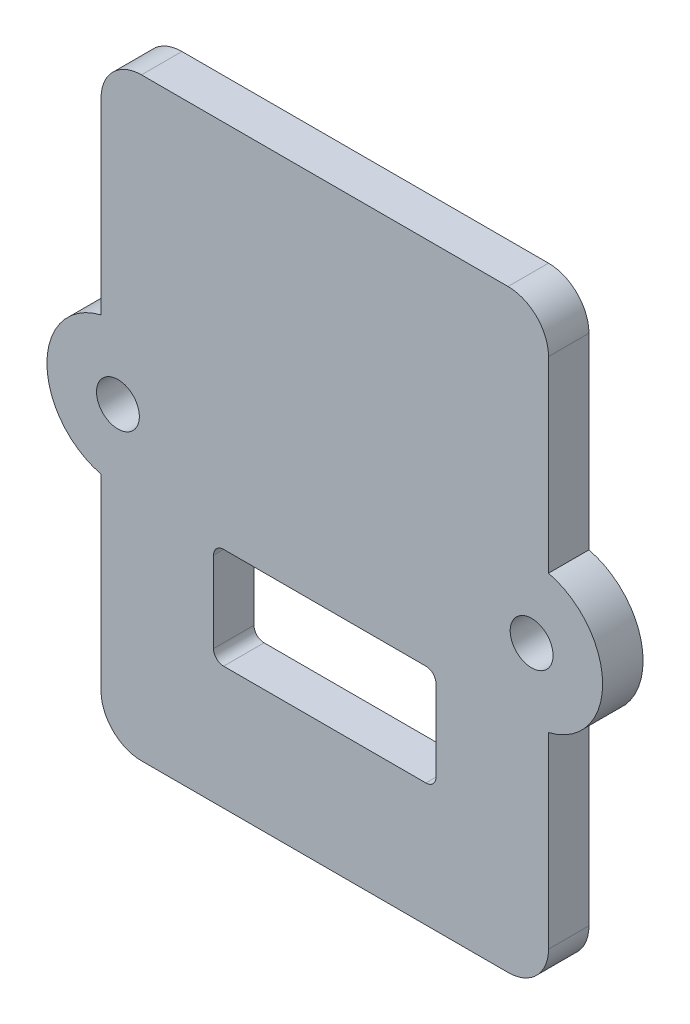
ISO-10303-21;
HEADER;
FILE_DESCRIPTION(('STEP AP214'),'2;1');
FILE_NAME('part.step','',(''),(''),'','','');
FILE_SCHEMA(('AUTOMOTIVE_DESIGN { 1 0 10303 214 1 1 1 1 }'));
ENDSEC;
DATA;
#1=APPLICATION_CONTEXT('core data for automotive mechanical design processes');
#2=APPLICATION_PROTOCOL_DEFINITION('international standard','automotive_design',2000,#1);
#3=PRODUCT_CONTEXT('',#1,'mechanical');
#4=PRODUCT('Part','Part','',(#3));
#5=PRODUCT_RELATED_PRODUCT_CATEGORY('part','',(#4));
#6=PRODUCT_DEFINITION_FORMATION('','',#4);
#7=PRODUCT_DEFINITION_CONTEXT('part definition',#1,'design');
#8=PRODUCT_DEFINITION('design','',#6,#7);
#9=PRODUCT_DEFINITION_SHAPE('','',#8);
#10=(LENGTH_UNIT() NAMED_UNIT(*) SI_UNIT(.MILLI.,.METRE.));
#11=(NAMED_UNIT(*) PLANE_ANGLE_UNIT() SI_UNIT($,.RADIAN.));
#12=(NAMED_UNIT(*) SI_UNIT($,.STERADIAN.) SOLID_ANGLE_UNIT());
#13=UNCERTAINTY_MEASURE_WITH_UNIT(LENGTH_MEASURE(1.E-05),#10,'distance_accuracy_value','');
#14=(GEOMETRIC_REPRESENTATION_CONTEXT(3) GLOBAL_UNCERTAINTY_ASSIGNED_CONTEXT((#13)) GLOBAL_UNIT_ASSIGNED_CONTEXT((#10,
#11,#12)) REPRESENTATION_CONTEXT('',''));
#15=CARTESIAN_POINT('',(0.,0.,0.));
#16=DIRECTION('',(0.,0.,1.));
#17=DIRECTION('',(1.,0.,0.));
#18=AXIS2_PLACEMENT_3D('',#15,#16,#17);
#19=CARTESIAN_POINT('',(0.,4.9,2.));
#20=DIRECTION('',(0.,1.,0.));
#21=DIRECTION('',(-1.,0.,0.));
#22=AXIS2_PLACEMENT_3D('',#19,#20,#21);
#23=PLANE('',#22);
#24=DIRECTION('',(1.,0.,0.));
#25=VECTOR('',#24,1.);
#26=CARTESIAN_POINT('',(0.,4.9,0.));
#27=LINE('',#26,#25);
#28=CARTESIAN_POINT('',(-5.,4.9,0.));
#29=VERTEX_POINT('',#28);
#30=CARTESIAN_POINT('',(5.,4.9,0.));
#31=VERTEX_POINT('',#30);
#32=EDGE_CURVE('E257',#29,#31,#27,.T.);
#33=ORIENTED_EDGE('',*,*,#32,.F.);
#34=DIRECTION('',(0.,0.,-1.));
#35=VECTOR('',#34,1.);
#36=CARTESIAN_POINT('',(-5.,4.9,2.));
#37=LINE('',#36,#35);
#38=CARTESIAN_POINT('',(-5.,4.9,2.));
#39=VERTEX_POINT('',#38);
#40=EDGE_CURVE('E11',#39,#29,#37,.T.);
#41=ORIENTED_EDGE('',*,*,#40,.F.);
#42=DIRECTION('',(1.,0.,0.));
#43=VECTOR('',#42,1.);
#44=CARTESIAN_POINT('',(0.,4.9,2.));
#45=LINE('',#44,#43);
#46=CARTESIAN_POINT('',(5.,4.9,2.));
#47=VERTEX_POINT('',#46);
#48=EDGE_CURVE('E398',#39,#47,#45,.T.);
#49=ORIENTED_EDGE('',*,*,#48,.T.);
#50=DIRECTION('',(0.,0.,-1.));
#51=VECTOR('',#50,1.);
#52=CARTESIAN_POINT('',(5.,4.9,2.));
#53=LINE('',#52,#51);
#54=EDGE_CURVE('E62',#47,#31,#53,.T.);
#55=ORIENTED_EDGE('',*,*,#54,.T.);
#56=EDGE_LOOP('',(#33,#41,#49,#55));
#57=FACE_BOUND('',#56,.T.);
#58=ADVANCED_FACE('F43',(#57),#23,.T.);
#59=CARTESIAN_POINT('',(-5.,5.4,2.));
#60=DIRECTION('',(0.,0.,-1.));
#61=DIRECTION('',(-1.,0.,0.));
#62=AXIS2_PLACEMENT_3D('',#59,#60,#61);
#63=CYLINDRICAL_SURFACE('',#62,0.5);
#64=CARTESIAN_POINT('',(-5.,5.4,0.));
#65=DIRECTION('',(0.,0.,1.));
#66=DIRECTION('',(1.,0.,0.));
#67=AXIS2_PLACEMENT_3D('',#64,#65,#66);
#68=CIRCLE('',#67,0.5);
#69=CARTESIAN_POINT('',(-5.5,5.4,0.));
#70=VERTEX_POINT('',#69);
#71=EDGE_CURVE('E259',#29,#70,#68,.F.);
#72=ORIENTED_EDGE('',*,*,#71,.T.);
#73=DIRECTION('',(0.,0.,-1.));
#74=VECTOR('',#73,1.);
#75=CARTESIAN_POINT('',(-5.5,5.4,2.));
#76=LINE('',#75,#74);
#77=CARTESIAN_POINT('',(-5.5,5.4,2.));
#78=VERTEX_POINT('',#77);
#79=EDGE_CURVE('E53',#78,#70,#76,.T.);
#80=ORIENTED_EDGE('',*,*,#79,.F.);
#81=CARTESIAN_POINT('',(-5.,5.4,2.));
#82=DIRECTION('',(0.,0.,1.));
#83=DIRECTION('',(1.,0.,0.));
#84=AXIS2_PLACEMENT_3D('',#81,#82,#83);
#85=CIRCLE('',#84,0.5);
#86=EDGE_CURVE('E400',#39,#78,#85,.F.);
#87=ORIENTED_EDGE('',*,*,#86,.F.);
#88=ORIENTED_EDGE('',*,*,#40,.T.);
#89=EDGE_LOOP('',(#72,#80,#87,#88));
#90=FACE_BOUND('',#89,.T.);
#91=ADVANCED_FACE('F428',(#90),#63,.F.);
#92=CARTESIAN_POINT('',(-5.49999999999999,0.,2.));
#93=DIRECTION('',(-1.,0.,0.));
#94=DIRECTION('',(0.,-1.,0.));
#95=AXIS2_PLACEMENT_3D('',#92,#93,#94);
#96=PLANE('',#95);
#97=DIRECTION('',(0.,1.,0.));
#98=VECTOR('',#97,1.);
#99=CARTESIAN_POINT('',(-5.49999999999999,0.,0.));
#100=LINE('',#99,#98);
#101=CARTESIAN_POINT('',(-5.5,9.4,0.));
#102=VERTEX_POINT('',#101);
#103=EDGE_CURVE('E262',#70,#102,#100,.T.);
#104=ORIENTED_EDGE('',*,*,#103,.T.);
#105=DIRECTION('',(0.,0.,-1.));
#106=VECTOR('',#105,1.);
#107=CARTESIAN_POINT('',(-5.5,9.4,2.));
#108=LINE('',#107,#106);
#109=CARTESIAN_POINT('',(-5.5,9.4,2.));
#110=VERTEX_POINT('',#109);
#111=EDGE_CURVE('E284',#110,#102,#108,.T.);
#112=ORIENTED_EDGE('',*,*,#111,.F.);
#113=DIRECTION('',(0.,1.,0.));
#114=VECTOR('',#113,1.);
#115=CARTESIAN_POINT('',(-5.49999999999999,0.,2.));
#116=LINE('',#115,#114);
#117=EDGE_CURVE('E403',#78,#110,#116,.T.);
#118=ORIENTED_EDGE('',*,*,#117,.F.);
#119=ORIENTED_EDGE('',*,*,#79,.T.);
#120=EDGE_LOOP('',(#104,#112,#118,#119));
#121=FACE_BOUND('',#120,.T.);
#122=ADVANCED_FACE('F433',(#121),#96,.F.);
#123=CARTESIAN_POINT('',(-5.,9.4,2.));
#124=DIRECTION('',(0.,0.,-1.));
#125=DIRECTION('',(-1.,0.,0.));
#126=AXIS2_PLACEMENT_3D('',#123,#124,#125);
#127=CYLINDRICAL_SURFACE('',#126,0.499999999999998);
#128=CARTESIAN_POINT('',(-5.,9.4,0.));
#129=DIRECTION('',(0.,0.,1.));
#130=DIRECTION('',(1.,0.,0.));
#131=AXIS2_PLACEMENT_3D('',#128,#129,#130);
#132=CIRCLE('',#131,0.499999999999998);
#133=CARTESIAN_POINT('',(-5.,9.9,0.));
#134=VERTEX_POINT('',#133);
#135=EDGE_CURVE('E265',#102,#134,#132,.F.);
#136=ORIENTED_EDGE('',*,*,#135,.T.);
#137=DIRECTION('',(0.,0.,-1.));
#138=VECTOR('',#137,1.);
#139=CARTESIAN_POINT('',(-5.,9.9,2.));
#140=LINE('',#139,#138);
#141=CARTESIAN_POINT('',(-5.,9.9,2.));
#142=VERTEX_POINT('',#141);
#143=EDGE_CURVE('E281',#142,#134,#140,.T.);
#144=ORIENTED_EDGE('',*,*,#143,.F.);
#145=CARTESIAN_POINT('',(-5.,9.4,2.));
#146=DIRECTION('',(0.,0.,1.));
#147=DIRECTION('',(1.,0.,0.));
#148=AXIS2_PLACEMENT_3D('',#145,#146,#147);
#149=CIRCLE('',#148,0.499999999999998);
#150=EDGE_CURVE('E406',#110,#142,#149,.F.);
#151=ORIENTED_EDGE('',*,*,#150,.F.);
#152=ORIENTED_EDGE('',*,*,#111,.T.);
#153=EDGE_LOOP('',(#136,#144,#151,#152));
#154=FACE_BOUND('',#153,.T.);
#155=ADVANCED_FACE('F410',(#154),#127,.F.);
#156=CARTESIAN_POINT('',(0.,9.9,2.));
#157=DIRECTION('',(0.,1.,0.));
#158=DIRECTION('',(-1.,0.,0.));
#159=AXIS2_PLACEMENT_3D('',#156,#157,#158);
#160=PLANE('',#159);
#161=DIRECTION('',(1.,0.,0.));
#162=VECTOR('',#161,1.);
#163=CARTESIAN_POINT('',(0.,9.9,0.));
#164=LINE('',#163,#162);
#165=CARTESIAN_POINT('',(5.,9.9,0.));
#166=VERTEX_POINT('',#165);
#167=EDGE_CURVE('E268',#134,#166,#164,.T.);
#168=ORIENTED_EDGE('',*,*,#167,.T.);
#169=DIRECTION('',(0.,0.,-1.));
#170=VECTOR('',#169,1.);
#171=CARTESIAN_POINT('',(5.,9.9,2.));
#172=LINE('',#171,#170);
#173=CARTESIAN_POINT('',(5.,9.9,2.));
#174=VERTEX_POINT('',#173);
#175=EDGE_CURVE('E206',#174,#166,#172,.T.);
#176=ORIENTED_EDGE('',*,*,#175,.F.);
#177=DIRECTION('',(1.,0.,0.));
#178=VECTOR('',#177,1.);
#179=CARTESIAN_POINT('',(0.,9.9,2.));
#180=LINE('',#179,#178);
#181=EDGE_CURVE('E195',#142,#174,#180,.T.);
#182=ORIENTED_EDGE('',*,*,#181,.F.);
#183=ORIENTED_EDGE('',*,*,#143,.T.);
#184=EDGE_LOOP('',(#168,#176,#182,#183));
#185=FACE_BOUND('',#184,.T.);
#186=ADVANCED_FACE('F412',(#185),#160,.F.);
#187=CARTESIAN_POINT('',(5.,9.4,2.));
#188=DIRECTION('',(0.,0.,-1.));
#189=DIRECTION('',(-1.,0.,0.));
#190=AXIS2_PLACEMENT_3D('',#187,#188,#189);
#191=CYLINDRICAL_SURFACE('',#190,0.499999999999998);
#192=CARTESIAN_POINT('',(5.,9.4,0.));
#193=DIRECTION('',(0.,0.,1.));
#194=DIRECTION('',(1.,0.,0.));
#195=AXIS2_PLACEMENT_3D('',#192,#193,#194);
#196=CIRCLE('',#195,0.499999999999998);
#197=CARTESIAN_POINT('',(5.5,9.4,0.));
#198=VERTEX_POINT('',#197);
#199=EDGE_CURVE('E203',#166,#198,#196,.F.);
#200=ORIENTED_EDGE('',*,*,#199,.T.);
#201=DIRECTION('',(0.,0.,-1.));
#202=VECTOR('',#201,1.);
#203=CARTESIAN_POINT('',(5.5,9.4,2.));
#204=LINE('',#203,#202);
#205=CARTESIAN_POINT('',(5.5,9.4,2.));
#206=VERTEX_POINT('',#205);
#207=EDGE_CURVE('E201',#206,#198,#204,.T.);
#208=ORIENTED_EDGE('',*,*,#207,.F.);
#209=CARTESIAN_POINT('',(5.,9.4,2.));
#210=DIRECTION('',(0.,0.,1.));
#211=DIRECTION('',(1.,0.,0.));
#212=AXIS2_PLACEMENT_3D('',#209,#210,#211);
#213=CIRCLE('',#212,0.499999999999998);
#214=EDGE_CURVE('E187',#174,#206,#213,.F.);
#215=ORIENTED_EDGE('',*,*,#214,.F.);
#216=ORIENTED_EDGE('',*,*,#175,.T.);
#217=EDGE_LOOP('',(#200,#208,#215,#216));
#218=FACE_BOUND('',#217,.T.);
#219=ADVANCED_FACE('F202',(#218),#191,.F.);
#220=CARTESIAN_POINT('',(5.5,0.,2.));
#221=DIRECTION('',(-1.,0.,0.));
#222=DIRECTION('',(0.,0.,1.));
#223=AXIS2_PLACEMENT_3D('',#220,#221,#222);
#224=PLANE('',#223);
#225=DIRECTION('',(0.,1.,0.));
#226=VECTOR('',#225,1.);
#227=CARTESIAN_POINT('',(5.5,0.,0.));
#228=LINE('',#227,#226);
#229=CARTESIAN_POINT('',(5.5,5.4,0.));
#230=VERTEX_POINT('',#229);
#231=EDGE_CURVE('E272',#230,#198,#228,.T.);
#232=ORIENTED_EDGE('',*,*,#231,.F.);
#233=DIRECTION('',(0.,0.,-1.));
#234=VECTOR('',#233,1.);
#235=CARTESIAN_POINT('',(5.5,5.4,2.));
#236=LINE('',#235,#234);
#237=CARTESIAN_POINT('',(5.5,5.4,2.));
#238=VERTEX_POINT('',#237);
#239=EDGE_CURVE('E123',#238,#230,#236,.T.);
#240=ORIENTED_EDGE('',*,*,#239,.F.);
#241=DIRECTION('',(0.,1.,0.));
#242=VECTOR('',#241,1.);
#243=CARTESIAN_POINT('',(5.5,0.,2.));
#244=LINE('',#243,#242);
#245=EDGE_CURVE('E193',#238,#206,#244,.T.);
#246=ORIENTED_EDGE('',*,*,#245,.T.);
#247=ORIENTED_EDGE('',*,*,#207,.T.);
#248=EDGE_LOOP('',(#232,#240,#246,#247));
#249=FACE_BOUND('',#248,.T.);
#250=ADVANCED_FACE('F208',(#249),#224,.T.);
#251=CARTESIAN_POINT('',(0.,28.1835878256806,2.));
#252=DIRECTION('',(0.,1.,0.));
#253=DIRECTION('',(-1.,0.,0.));
#254=AXIS2_PLACEMENT_3D('',#251,#252,#253);
#255=PLANE('',#254);
#256=DIRECTION('',(1.,0.,0.));
#257=VECTOR('',#256,1.);
#258=CARTESIAN_POINT('',(0.,28.1835878256806,0.));
#259=LINE('',#258,#257);
#260=CARTESIAN_POINT('',(-9.06,28.1835878256806,0.));
#261=VERTEX_POINT('',#260);
#262=CARTESIAN_POINT('',(9.06000000000001,28.1835878256806,0.));
#263=VERTEX_POINT('',#262);
#264=EDGE_CURVE('E215',#261,#263,#259,.T.);
#265=ORIENTED_EDGE('',*,*,#264,.F.);
#266=DIRECTION('',(0.,0.,-1.));
#267=VECTOR('',#266,1.);
#268=CARTESIAN_POINT('',(-9.06,28.1835878256806,2.));
#269=LINE('',#268,#267);
#270=CARTESIAN_POINT('',(-9.06,28.1835878256806,2.));
#271=VERTEX_POINT('',#270);
#272=EDGE_CURVE('E47',#271,#261,#269,.T.);
#273=ORIENTED_EDGE('',*,*,#272,.F.);
#274=DIRECTION('',(1.,0.,0.));
#275=VECTOR('',#274,1.);
#276=CARTESIAN_POINT('',(0.,28.1835878256806,2.));
#277=LINE('',#276,#275);
#278=CARTESIAN_POINT('',(9.06000000000001,28.1835878256806,2.));
#279=VERTEX_POINT('',#278);
#280=EDGE_CURVE('E277',#271,#279,#277,.T.);
#281=ORIENTED_EDGE('',*,*,#280,.T.);
#282=DIRECTION('',(0.,0.,-1.));
#283=VECTOR('',#282,1.);
#284=CARTESIAN_POINT('',(9.06000000000001,28.1835878256806,2.));
#285=LINE('',#284,#283);
#286=EDGE_CURVE('E211',#279,#263,#285,.T.);
#287=ORIENTED_EDGE('',*,*,#286,.T.);
#288=EDGE_LOOP('',(#265,#273,#281,#287));
#289=FACE_BOUND('',#288,.T.);
#290=ADVANCED_FACE('F45',(#289),#255,.T.);
#291=CARTESIAN_POINT('',(-9.06,26.1835878256806,2.));
#292=DIRECTION('',(0.,0.,-1.));
#293=DIRECTION('',(-1.,0.,0.));
#294=AXIS2_PLACEMENT_3D('',#291,#292,#293);
#295=CYLINDRICAL_SURFACE('',#294,2.);
#296=CARTESIAN_POINT('',(-9.06,26.1835878256806,0.));
#297=DIRECTION('',(0.,0.,1.));
#298=DIRECTION('',(1.,0.,0.));
#299=AXIS2_PLACEMENT_3D('',#296,#297,#298);
#300=CIRCLE('',#299,2.);
#301=CARTESIAN_POINT('',(-11.06,26.1835878256806,0.));
#302=VERTEX_POINT('',#301);
#303=EDGE_CURVE('E218',#261,#302,#300,.T.);
#304=ORIENTED_EDGE('',*,*,#303,.T.);
#305=DIRECTION('',(0.,0.,-1.));
#306=VECTOR('',#305,1.);
#307=CARTESIAN_POINT('',(-11.06,26.1835878256806,2.));
#308=LINE('',#307,#306);
#309=CARTESIAN_POINT('',(-11.06,26.1835878256806,2.));
#310=VERTEX_POINT('',#309);
#311=EDGE_CURVE('E307',#310,#302,#308,.T.);
#312=ORIENTED_EDGE('',*,*,#311,.F.);
#313=CARTESIAN_POINT('',(-9.06,26.1835878256806,2.));
#314=DIRECTION('',(0.,0.,1.));
#315=DIRECTION('',(1.,0.,0.));
#316=AXIS2_PLACEMENT_3D('',#313,#314,#315);
#317=CIRCLE('',#316,2.);
#318=EDGE_CURVE('E315',#271,#310,#317,.T.);
#319=ORIENTED_EDGE('',*,*,#318,.F.);
#320=ORIENTED_EDGE('',*,*,#272,.T.);
#321=EDGE_LOOP('',(#304,#312,#319,#320));
#322=FACE_BOUND('',#321,.T.);
#323=ADVANCED_FACE('F314',(#322),#295,.T.);
#324=CARTESIAN_POINT('',(-11.06,0.,2.));
#325=DIRECTION('',(-1.,0.,0.));
#326=DIRECTION('',(0.,-1.,0.));
#327=AXIS2_PLACEMENT_3D('',#324,#325,#326);
#328=PLANE('',#327);
#329=DIRECTION('',(0.,1.,0.));
#330=VECTOR('',#329,1.);
#331=CARTESIAN_POINT('',(-11.06,0.,0.));
#332=LINE('',#331,#330);
#333=CARTESIAN_POINT('',(-11.06,16.9092337848848,0.));
#334=VERTEX_POINT('',#333);
#335=EDGE_CURVE('E221',#334,#302,#332,.T.);
#336=ORIENTED_EDGE('',*,*,#335,.F.);
#337=DIRECTION('',(0.,0.,-1.));
#338=VECTOR('',#337,1.);
#339=CARTESIAN_POINT('',(-11.06,16.9092337848848,2.));
#340=LINE('',#339,#338);
#341=CARTESIAN_POINT('',(-11.06,16.9092337848848,2.));
#342=VERTEX_POINT('',#341);
#343=EDGE_CURVE('E306',#342,#334,#340,.T.);
#344=ORIENTED_EDGE('',*,*,#343,.F.);
#345=DIRECTION('',(0.,1.,0.));
#346=VECTOR('',#345,1.);
#347=CARTESIAN_POINT('',(-11.06,0.,2.));
#348=LINE('',#347,#346);
#349=EDGE_CURVE('E371',#342,#310,#348,.T.);
#350=ORIENTED_EDGE('',*,*,#349,.T.);
#351=ORIENTED_EDGE('',*,*,#311,.T.);
#352=EDGE_LOOP('',(#336,#344,#350,#351));
#353=FACE_BOUND('',#352,.T.);
#354=ADVANCED_FACE('F369',(#353),#328,.T.);
#355=CARTESIAN_POINT('',(-10.225,13.5,2.));
#356=DIRECTION('',(0.,0.,-1.));
#357=DIRECTION('',(-1.,0.,0.));
#358=AXIS2_PLACEMENT_3D('',#355,#356,#357);
#359=CYLINDRICAL_SURFACE('',#358,3.51);
#360=CARTESIAN_POINT('',(-10.225,13.5,0.));
#361=DIRECTION('',(0.,0.,1.));
#362=DIRECTION('',(1.,0.,0.));
#363=AXIS2_PLACEMENT_3D('',#360,#361,#362);
#364=CIRCLE('',#363,3.51);
#365=CARTESIAN_POINT('',(-11.06,10.0907662151152,0.));
#366=VERTEX_POINT('',#365);
#367=EDGE_CURVE('E224',#334,#366,#364,.T.);
#368=ORIENTED_EDGE('',*,*,#367,.T.);
#369=DIRECTION('',(0.,0.,-1.));
#370=VECTOR('',#369,1.);
#371=CARTESIAN_POINT('',(-11.06,10.0907662151152,2.));
#372=LINE('',#371,#370);
#373=CARTESIAN_POINT('',(-11.06,10.0907662151152,2.));
#374=VERTEX_POINT('',#373);
#375=EDGE_CURVE('E304',#374,#366,#372,.T.);
#376=ORIENTED_EDGE('',*,*,#375,.F.);
#377=CARTESIAN_POINT('',(-10.225,13.5,2.));
#378=DIRECTION('',(0.,0.,1.));
#379=DIRECTION('',(1.,0.,0.));
#380=AXIS2_PLACEMENT_3D('',#377,#378,#379);
#381=CIRCLE('',#380,3.51);
#382=EDGE_CURVE('E372',#342,#374,#381,.T.);
#383=ORIENTED_EDGE('',*,*,#382,.F.);
#384=ORIENTED_EDGE('',*,*,#343,.T.);
#385=EDGE_LOOP('',(#368,#376,#383,#384));
#386=FACE_BOUND('',#385,.T.);
#387=ADVANCED_FACE('F368',(#386),#359,.T.);
#388=CARTESIAN_POINT('',(-11.06,0.,2.));
#389=DIRECTION('',(-1.,0.,0.));
#390=DIRECTION('',(0.,-1.,0.));
#391=AXIS2_PLACEMENT_3D('',#388,#389,#390);
#392=PLANE('',#391);
#393=DIRECTION('',(0.,1.,0.));
#394=VECTOR('',#393,1.);
#395=CARTESIAN_POINT('',(-11.06,0.,0.));
#396=LINE('',#395,#394);
#397=CARTESIAN_POINT('',(-11.06,0.816412174319438,0.));
#398=VERTEX_POINT('',#397);
#399=EDGE_CURVE('E227',#398,#366,#396,.T.);
#400=ORIENTED_EDGE('',*,*,#399,.F.);
#401=DIRECTION('',(0.,0.,-1.));
#402=VECTOR('',#401,1.);
#403=CARTESIAN_POINT('',(-11.06,0.816412174319438,2.));
#404=LINE('',#403,#402);
#405=CARTESIAN_POINT('',(-11.06,0.816412174319438,2.));
#406=VERTEX_POINT('',#405);
#407=EDGE_CURVE('E302',#406,#398,#404,.T.);
#408=ORIENTED_EDGE('',*,*,#407,.F.);
#409=DIRECTION('',(0.,1.,0.));
#410=VECTOR('',#409,1.);
#411=CARTESIAN_POINT('',(-11.06,0.,2.));
#412=LINE('',#411,#410);
#413=EDGE_CURVE('E365',#406,#374,#412,.T.);
#414=ORIENTED_EDGE('',*,*,#413,.T.);
#415=ORIENTED_EDGE('',*,*,#375,.T.);
#416=EDGE_LOOP('',(#400,#408,#414,#415));
#417=FACE_BOUND('',#416,.T.);
#418=ADVANCED_FACE('F361',(#417),#392,.T.);
#419=CARTESIAN_POINT('',(-9.05999999999999,0.816412174319438,2.));
#420=DIRECTION('',(0.,0.,-1.));
#421=DIRECTION('',(-1.,0.,0.));
#422=AXIS2_PLACEMENT_3D('',#419,#420,#421);
#423=CYLINDRICAL_SURFACE('',#422,2.);
#424=CARTESIAN_POINT('',(-9.05999999999999,0.816412174319438,0.));
#425=DIRECTION('',(0.,0.,1.));
#426=DIRECTION('',(1.,0.,0.));
#427=AXIS2_PLACEMENT_3D('',#424,#425,#426);
#428=CIRCLE('',#427,2.);
#429=CARTESIAN_POINT('',(-9.05999999999999,-1.18358782568056,0.));
#430=VERTEX_POINT('',#429);
#431=EDGE_CURVE('E230',#398,#430,#428,.T.);
#432=ORIENTED_EDGE('',*,*,#431,.T.);
#433=DIRECTION('',(0.,0.,-1.));
#434=VECTOR('',#433,1.);
#435=CARTESIAN_POINT('',(-9.05999999999999,-1.18358782568056,2.));
#436=LINE('',#435,#434);
#437=CARTESIAN_POINT('',(-9.05999999999999,-1.18358782568056,2.));
#438=VERTEX_POINT('',#437);
#439=EDGE_CURVE('E300',#438,#430,#436,.T.);
#440=ORIENTED_EDGE('',*,*,#439,.F.);
#441=CARTESIAN_POINT('',(-9.05999999999999,0.816412174319438,2.));
#442=DIRECTION('',(0.,0.,1.));
#443=DIRECTION('',(1.,0.,0.));
#444=AXIS2_PLACEMENT_3D('',#441,#442,#443);
#445=CIRCLE('',#444,2.);
#446=EDGE_CURVE('E381',#406,#438,#445,.T.);
#447=ORIENTED_EDGE('',*,*,#446,.F.);
#448=ORIENTED_EDGE('',*,*,#407,.T.);
#449=EDGE_LOOP('',(#432,#440,#447,#448));
#450=FACE_BOUND('',#449,.T.);
#451=ADVANCED_FACE('F358',(#450),#423,.T.);
#452=CARTESIAN_POINT('',(0.,-1.18358782568056,2.));
#453=DIRECTION('',(0.,-1.,0.));
#454=DIRECTION('',(1.,0.,0.));
#455=AXIS2_PLACEMENT_3D('',#452,#453,#454);
#456=PLANE('',#455);
#457=DIRECTION('',(-1.,0.,0.));
#458=VECTOR('',#457,1.);
#459=CARTESIAN_POINT('',(0.,-1.18358782568056,0.));
#460=LINE('',#459,#458);
#461=CARTESIAN_POINT('',(9.06000000000001,-1.18358782568056,0.));
#462=VERTEX_POINT('',#461);
#463=EDGE_CURVE('E233',#462,#430,#460,.T.);
#464=ORIENTED_EDGE('',*,*,#463,.F.);
#465=DIRECTION('',(0.,0.,-1.));
#466=VECTOR('',#465,1.);
#467=CARTESIAN_POINT('',(9.06000000000001,-1.18358782568056,2.));
#468=LINE('',#467,#466);
#469=CARTESIAN_POINT('',(9.06000000000001,-1.18358782568056,2.));
#470=VERTEX_POINT('',#469);
#471=EDGE_CURVE('E298',#470,#462,#468,.T.);
#472=ORIENTED_EDGE('',*,*,#471,.F.);
#473=DIRECTION('',(-1.,0.,0.));
#474=VECTOR('',#473,1.);
#475=CARTESIAN_POINT('',(0.,-1.18358782568056,2.));
#476=LINE('',#475,#474);
#477=EDGE_CURVE('E355',#470,#438,#476,.T.);
#478=ORIENTED_EDGE('',*,*,#477,.T.);
#479=ORIENTED_EDGE('',*,*,#439,.T.);
#480=EDGE_LOOP('',(#464,#472,#478,#479));
#481=FACE_BOUND('',#480,.T.);
#482=ADVANCED_FACE('F351',(#481),#456,.T.);
#483=CARTESIAN_POINT('',(9.06000000000001,0.816412174319441,2.));
#484=DIRECTION('',(0.,0.,-1.));
#485=DIRECTION('',(-1.,0.,0.));
#486=AXIS2_PLACEMENT_3D('',#483,#484,#485);
#487=CYLINDRICAL_SURFACE('',#486,2.);
#488=CARTESIAN_POINT('',(9.06000000000001,0.816412174319441,0.));
#489=DIRECTION('',(0.,0.,1.));
#490=DIRECTION('',(1.,0.,0.));
#491=AXIS2_PLACEMENT_3D('',#488,#489,#490);
#492=CIRCLE('',#491,2.);
#493=CARTESIAN_POINT('',(11.06,0.816412174319441,0.));
#494=VERTEX_POINT('',#493);
#495=EDGE_CURVE('E236',#462,#494,#492,.T.);
#496=ORIENTED_EDGE('',*,*,#495,.T.);
#497=DIRECTION('',(0.,0.,-1.));
#498=VECTOR('',#497,1.);
#499=CARTESIAN_POINT('',(11.06,0.816412174319441,2.));
#500=LINE('',#499,#498);
#501=CARTESIAN_POINT('',(11.06,0.816412174319441,2.));
#502=VERTEX_POINT('',#501);
#503=EDGE_CURVE('E296',#502,#494,#500,.T.);
#504=ORIENTED_EDGE('',*,*,#503,.F.);
#505=CARTESIAN_POINT('',(9.06000000000001,0.816412174319441,2.));
#506=DIRECTION('',(0.,0.,1.));
#507=DIRECTION('',(1.,0.,0.));
#508=AXIS2_PLACEMENT_3D('',#505,#506,#507);
#509=CIRCLE('',#508,2.);
#510=EDGE_CURVE('E384',#470,#502,#509,.T.);
#511=ORIENTED_EDGE('',*,*,#510,.F.);
#512=ORIENTED_EDGE('',*,*,#471,.T.);
#513=EDGE_LOOP('',(#496,#504,#511,#512));
#514=FACE_BOUND('',#513,.T.);
#515=ADVANCED_FACE('F347',(#514),#487,.T.);
#516=CARTESIAN_POINT('',(11.06,0.,2.));
#517=DIRECTION('',(1.,0.,0.));
#518=DIRECTION('',(0.,0.,-1.));
#519=AXIS2_PLACEMENT_3D('',#516,#517,#518);
#520=PLANE('',#519);
#521=DIRECTION('',(0.,-1.,0.));
#522=VECTOR('',#521,1.);
#523=CARTESIAN_POINT('',(11.06,0.,0.));
#524=LINE('',#523,#522);
#525=CARTESIAN_POINT('',(11.06,10.0907662151152,0.));
#526=VERTEX_POINT('',#525);
#527=EDGE_CURVE('E239',#526,#494,#524,.T.);
#528=ORIENTED_EDGE('',*,*,#527,.F.);
#529=DIRECTION('',(0.,0.,-1.));
#530=VECTOR('',#529,1.);
#531=CARTESIAN_POINT('',(11.06,10.0907662151152,2.));
#532=LINE('',#531,#530);
#533=CARTESIAN_POINT('',(11.06,10.0907662151152,2.));
#534=VERTEX_POINT('',#533);
#535=EDGE_CURVE('E294',#534,#526,#532,.T.);
#536=ORIENTED_EDGE('',*,*,#535,.F.);
#537=DIRECTION('',(0.,-1.,0.));
#538=VECTOR('',#537,1.);
#539=CARTESIAN_POINT('',(11.06,0.,2.));
#540=LINE('',#539,#538);
#541=EDGE_CURVE('E344',#534,#502,#540,.T.);
#542=ORIENTED_EDGE('',*,*,#541,.T.);
#543=ORIENTED_EDGE('',*,*,#503,.T.);
#544=EDGE_LOOP('',(#528,#536,#542,#543));
#545=FACE_BOUND('',#544,.T.);
#546=ADVANCED_FACE('F340',(#545),#520,.T.);
#547=CARTESIAN_POINT('',(10.225,13.5,2.));
#548=DIRECTION('',(0.,0.,-1.));
#549=DIRECTION('',(-1.,0.,0.));
#550=AXIS2_PLACEMENT_3D('',#547,#548,#549);
#551=CYLINDRICAL_SURFACE('',#550,3.51000000000001);
#552=CARTESIAN_POINT('',(10.225,13.5,0.));
#553=DIRECTION('',(0.,0.,1.));
#554=DIRECTION('',(1.,0.,0.));
#555=AXIS2_PLACEMENT_3D('',#552,#553,#554);
#556=CIRCLE('',#555,3.51000000000001);
#557=CARTESIAN_POINT('',(11.06,16.9092337848848,0.));
#558=VERTEX_POINT('',#557);
#559=EDGE_CURVE('E242',#526,#558,#556,.T.);
#560=ORIENTED_EDGE('',*,*,#559,.T.);
#561=DIRECTION('',(0.,0.,-1.));
#562=VECTOR('',#561,1.);
#563=CARTESIAN_POINT('',(11.06,16.9092337848848,2.));
#564=LINE('',#563,#562);
#565=CARTESIAN_POINT('',(11.06,16.9092337848848,2.));
#566=VERTEX_POINT('',#565);
#567=EDGE_CURVE('E292',#566,#558,#564,.T.);
#568=ORIENTED_EDGE('',*,*,#567,.F.);
#569=CARTESIAN_POINT('',(10.225,13.5,2.));
#570=DIRECTION('',(0.,0.,1.));
#571=DIRECTION('',(1.,0.,0.));
#572=AXIS2_PLACEMENT_3D('',#569,#570,#571);
#573=CIRCLE('',#572,3.51000000000001);
#574=EDGE_CURVE('E387',#534,#566,#573,.T.);
#575=ORIENTED_EDGE('',*,*,#574,.F.);
#576=ORIENTED_EDGE('',*,*,#535,.T.);
#577=EDGE_LOOP('',(#560,#568,#575,#576));
#578=FACE_BOUND('',#577,.T.);
#579=ADVANCED_FACE('F336',(#578),#551,.T.);
#580=CARTESIAN_POINT('',(11.06,0.,2.));
#581=DIRECTION('',(1.,0.,0.));
#582=DIRECTION('',(0.,1.,0.));
#583=AXIS2_PLACEMENT_3D('',#580,#581,#582);
#584=PLANE('',#583);
#585=DIRECTION('',(0.,-1.,0.));
#586=VECTOR('',#585,1.);
#587=CARTESIAN_POINT('',(11.06,0.,0.));
#588=LINE('',#587,#586);
#589=CARTESIAN_POINT('',(11.06,26.1835878256806,0.));
#590=VERTEX_POINT('',#589);
#591=EDGE_CURVE('E245',#590,#558,#588,.T.);
#592=ORIENTED_EDGE('',*,*,#591,.F.);
#593=DIRECTION('',(0.,0.,-1.));
#594=VECTOR('',#593,1.);
#595=CARTESIAN_POINT('',(11.06,26.1835878256806,2.));
#596=LINE('',#595,#594);
#597=CARTESIAN_POINT('',(11.06,26.1835878256806,2.));
#598=VERTEX_POINT('',#597);
#599=EDGE_CURVE('E290',#598,#590,#596,.T.);
#600=ORIENTED_EDGE('',*,*,#599,.F.);
#601=DIRECTION('',(0.,-1.,0.));
#602=VECTOR('',#601,1.);
#603=CARTESIAN_POINT('',(11.06,0.,2.));
#604=LINE('',#603,#602);
#605=EDGE_CURVE('E333',#598,#566,#604,.T.);
#606=ORIENTED_EDGE('',*,*,#605,.T.);
#607=ORIENTED_EDGE('',*,*,#567,.T.);
#608=EDGE_LOOP('',(#592,#600,#606,#607));
#609=FACE_BOUND('',#608,.T.);
#610=ADVANCED_FACE('F329',(#609),#584,.T.);
#611=CARTESIAN_POINT('',(10.225,13.5,2.));
#612=DIRECTION('',(0.,0.,-1.));
#613=DIRECTION('',(-1.,0.,0.));
#614=AXIS2_PLACEMENT_3D('',#611,#612,#613);
#615=CYLINDRICAL_SURFACE('',#614,1.06);
#616=CARTESIAN_POINT('',(10.225,13.5,2.));
#617=DIRECTION('',(0.,0.,1.));
#618=DIRECTION('',(1.,0.,0.));
#619=AXIS2_PLACEMENT_3D('',#616,#617,#618);
#620=CIRCLE('',#619,1.06);
#621=CARTESIAN_POINT('',(11.285,13.5,2.));
#622=VERTEX_POINT('',#621);
#623=EDGE_CURVE('E395',#622,#622,#620,.F.);
#624=ORIENTED_EDGE('',*,*,#623,.F.);
#625=EDGE_LOOP('',(#624));
#626=FACE_BOUND('',#625,.T.);
#627=CARTESIAN_POINT('',(10.225,13.5,0.));
#628=DIRECTION('',(0.,0.,1.));
#629=DIRECTION('',(1.,0.,0.));
#630=AXIS2_PLACEMENT_3D('',#627,#628,#629);
#631=CIRCLE('',#630,1.06);
#632=CARTESIAN_POINT('',(11.285,13.5,0.));
#633=VERTEX_POINT('',#632);
#634=EDGE_CURVE('E254',#633,#633,#631,.F.);
#635=ORIENTED_EDGE('',*,*,#634,.T.);
#636=EDGE_LOOP('',(#635));
#637=FACE_BOUND('',#636,.T.);
#638=ADVANCED_FACE('F438',(#626,#637),#615,.F.);
#639=CARTESIAN_POINT('',(-10.225,13.5,2.));
#640=DIRECTION('',(0.,0.,-1.));
#641=DIRECTION('',(-1.,0.,0.));
#642=AXIS2_PLACEMENT_3D('',#639,#640,#641);
#643=CYLINDRICAL_SURFACE('',#642,1.06);
#644=CARTESIAN_POINT('',(-10.225,13.5,2.));
#645=DIRECTION('',(0.,0.,1.));
#646=DIRECTION('',(1.,0.,0.));
#647=AXIS2_PLACEMENT_3D('',#644,#645,#646);
#648=CIRCLE('',#647,1.06);
#649=CARTESIAN_POINT('',(-9.16499999999999,13.5,2.));
#650=VERTEX_POINT('',#649);
#651=EDGE_CURVE('E392',#650,#650,#648,.T.);
#652=ORIENTED_EDGE('',*,*,#651,.T.);
#653=EDGE_LOOP('',(#652));
#654=FACE_BOUND('',#653,.T.);
#655=CARTESIAN_POINT('',(-10.225,13.5,0.));
#656=DIRECTION('',(0.,0.,1.));
#657=DIRECTION('',(1.,0.,0.));
#658=AXIS2_PLACEMENT_3D('',#655,#656,#657);
#659=CIRCLE('',#658,1.06);
#660=CARTESIAN_POINT('',(-9.16499999999999,13.5,0.));
#661=VERTEX_POINT('',#660);
#662=EDGE_CURVE('E251',#661,#661,#659,.T.);
#663=ORIENTED_EDGE('',*,*,#662,.F.);
#664=EDGE_LOOP('',(#663));
#665=FACE_BOUND('',#664,.T.);
#666=ADVANCED_FACE('F423',(#654,#665),#643,.F.);
#667=CARTESIAN_POINT('',(9.06000000000001,26.1835878256806,2.));
#668=DIRECTION('',(0.,0.,-1.));
#669=DIRECTION('',(-1.,0.,0.));
#670=AXIS2_PLACEMENT_3D('',#667,#668,#669);
#671=CYLINDRICAL_SURFACE('',#670,2.);
#672=CARTESIAN_POINT('',(9.06000000000001,26.1835878256806,0.));
#673=DIRECTION('',(0.,0.,1.));
#674=DIRECTION('',(1.,0.,0.));
#675=AXIS2_PLACEMENT_3D('',#672,#673,#674);
#676=CIRCLE('',#675,2.);
#677=EDGE_CURVE('E248',#590,#263,#676,.T.);
#678=ORIENTED_EDGE('',*,*,#677,.T.);
#679=ORIENTED_EDGE('',*,*,#286,.F.);
#680=CARTESIAN_POINT('',(9.06000000000001,26.1835878256806,2.));
#681=DIRECTION('',(0.,0.,1.));
#682=DIRECTION('',(1.,0.,0.));
#683=AXIS2_PLACEMENT_3D('',#680,#681,#682);
#684=CIRCLE('',#683,2.);
#685=EDGE_CURVE('E390',#598,#279,#684,.T.);
#686=ORIENTED_EDGE('',*,*,#685,.F.);
#687=ORIENTED_EDGE('',*,*,#599,.T.);
#688=EDGE_LOOP('',(#678,#679,#686,#687));
#689=FACE_BOUND('',#688,.T.);
#690=ADVANCED_FACE('F325',(#689),#671,.T.);
#691=CARTESIAN_POINT('',(5.,5.4,2.));
#692=DIRECTION('',(0.,0.,-1.));
#693=DIRECTION('',(-1.,0.,0.));
#694=AXIS2_PLACEMENT_3D('',#691,#692,#693);
#695=CYLINDRICAL_SURFACE('',#694,0.500000000000001);
#696=CARTESIAN_POINT('',(5.,5.4,0.));
#697=DIRECTION('',(0.,0.,1.));
#698=DIRECTION('',(1.,0.,0.));
#699=AXIS2_PLACEMENT_3D('',#696,#697,#698);
#700=CIRCLE('',#699,0.500000000000001);
#701=EDGE_CURVE('E274',#31,#230,#700,.T.);
#702=ORIENTED_EDGE('',*,*,#701,.F.);
#703=ORIENTED_EDGE('',*,*,#54,.F.);
#704=CARTESIAN_POINT('',(5.,5.4,2.));
#705=DIRECTION('',(0.,0.,1.));
#706=DIRECTION('',(1.,0.,0.));
#707=AXIS2_PLACEMENT_3D('',#704,#705,#706);
#708=CIRCLE('',#707,0.500000000000001);
#709=EDGE_CURVE('E209',#47,#238,#708,.T.);
#710=ORIENTED_EDGE('',*,*,#709,.T.);
#711=ORIENTED_EDGE('',*,*,#239,.T.);
#712=EDGE_LOOP('',(#702,#703,#710,#711));
#713=FACE_BOUND('',#712,.T.);
#714=ADVANCED_FACE('F415',(#713),#695,.F.);
#715=CARTESIAN_POINT('',(0.,0.,2.));
#716=DIRECTION('',(0.,0.,1.));
#717=DIRECTION('',(1.,0.,0.));
#718=AXIS2_PLACEMENT_3D('',#715,#716,#717);
#719=PLANE('',#718);
#720=ORIENTED_EDGE('',*,*,#280,.F.);
#721=ORIENTED_EDGE('',*,*,#318,.T.);
#722=ORIENTED_EDGE('',*,*,#349,.F.);
#723=ORIENTED_EDGE('',*,*,#382,.T.);
#724=ORIENTED_EDGE('',*,*,#413,.F.);
#725=ORIENTED_EDGE('',*,*,#446,.T.);
#726=ORIENTED_EDGE('',*,*,#477,.F.);
#727=ORIENTED_EDGE('',*,*,#510,.T.);
#728=ORIENTED_EDGE('',*,*,#541,.F.);
#729=ORIENTED_EDGE('',*,*,#574,.T.);
#730=ORIENTED_EDGE('',*,*,#605,.F.);
#731=ORIENTED_EDGE('',*,*,#685,.T.);
#732=EDGE_LOOP('',(#720,#721,#722,#723,#724,#725,#726,#727,#728,#729,#730,#731));
#733=FACE_BOUND('',#732,.T.);
#734=ORIENTED_EDGE('',*,*,#651,.F.);
#735=EDGE_LOOP('',(#734));
#736=FACE_BOUND('',#735,.T.);
#737=ORIENTED_EDGE('',*,*,#623,.T.);
#738=EDGE_LOOP('',(#737));
#739=FACE_BOUND('',#738,.T.);
#740=ORIENTED_EDGE('',*,*,#48,.F.);
#741=ORIENTED_EDGE('',*,*,#86,.T.);
#742=ORIENTED_EDGE('',*,*,#117,.T.);
#743=ORIENTED_EDGE('',*,*,#150,.T.);
#744=ORIENTED_EDGE('',*,*,#181,.T.);
#745=ORIENTED_EDGE('',*,*,#214,.T.);
#746=ORIENTED_EDGE('',*,*,#245,.F.);
#747=ORIENTED_EDGE('',*,*,#709,.F.);
#748=EDGE_LOOP('',(#740,#741,#742,#743,#744,#745,#746,#747));
#749=FACE_BOUND('',#748,.T.);
#750=ADVANCED_FACE('F190',(#733,#736,#739,#749),#719,.T.);
#751=CARTESIAN_POINT('',(0.,0.,0.));
#752=DIRECTION('',(0.,0.,1.));
#753=DIRECTION('',(1.,0.,0.));
#754=AXIS2_PLACEMENT_3D('',#751,#752,#753);
#755=PLANE('',#754);
#756=ORIENTED_EDGE('',*,*,#264,.T.);
#757=ORIENTED_EDGE('',*,*,#677,.F.);
#758=ORIENTED_EDGE('',*,*,#591,.T.);
#759=ORIENTED_EDGE('',*,*,#559,.F.);
#760=ORIENTED_EDGE('',*,*,#527,.T.);
#761=ORIENTED_EDGE('',*,*,#495,.F.);
#762=ORIENTED_EDGE('',*,*,#463,.T.);
#763=ORIENTED_EDGE('',*,*,#431,.F.);
#764=ORIENTED_EDGE('',*,*,#399,.T.);
#765=ORIENTED_EDGE('',*,*,#367,.F.);
#766=ORIENTED_EDGE('',*,*,#335,.T.);
#767=ORIENTED_EDGE('',*,*,#303,.F.);
#768=EDGE_LOOP('',(#756,#757,#758,#759,#760,#761,#762,#763,#764,#765,#766,#767));
#769=FACE_BOUND('',#768,.T.);
#770=ORIENTED_EDGE('',*,*,#662,.T.);
#771=EDGE_LOOP('',(#770));
#772=FACE_BOUND('',#771,.T.);
#773=ORIENTED_EDGE('',*,*,#634,.F.);
#774=EDGE_LOOP('',(#773));
#775=FACE_BOUND('',#774,.T.);
#776=ORIENTED_EDGE('',*,*,#32,.T.);
#777=ORIENTED_EDGE('',*,*,#701,.T.);
#778=ORIENTED_EDGE('',*,*,#231,.T.);
#779=ORIENTED_EDGE('',*,*,#199,.F.);
#780=ORIENTED_EDGE('',*,*,#167,.F.);
#781=ORIENTED_EDGE('',*,*,#135,.F.);
#782=ORIENTED_EDGE('',*,*,#103,.F.);
#783=ORIENTED_EDGE('',*,*,#71,.F.);
#784=EDGE_LOOP('',(#776,#777,#778,#779,#780,#781,#782,#783));
#785=FACE_BOUND('',#784,.T.);
#786=ADVANCED_FACE('F318',(#769,#772,#775,#785),#755,.F.);
#787=CLOSED_SHELL('',(#58,#91,#122,#155,#186,#219,#250,#290,#323,#354,#387,#418,#451,#482,#515,
#546,#579,#610,#638,#666,#690,#714,#750,#786));
#788=MANIFOLD_SOLID_BREP('B2',#787);
#789=ADVANCED_BREP_SHAPE_REPRESENTATION('',(#18,#788),#14);
#790=SHAPE_DEFINITION_REPRESENTATION(#9,#789);
ENDSEC;
END-ISO-10303-21;
